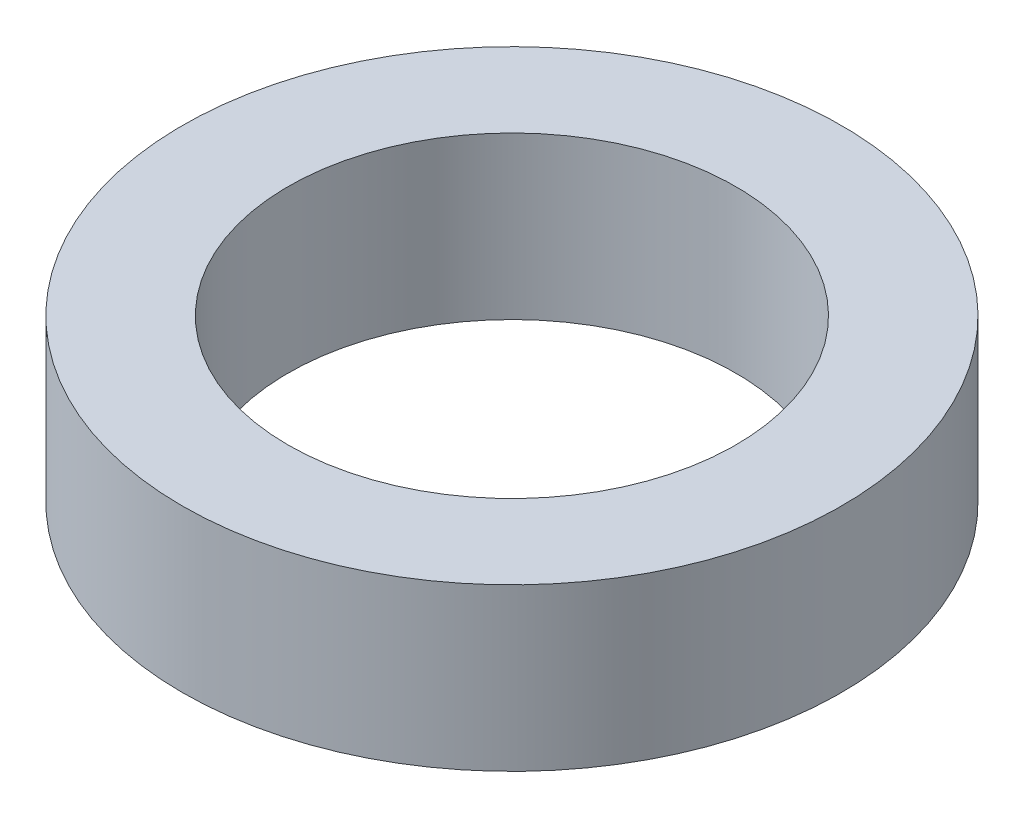
ISO-10303-21;
HEADER;
FILE_DESCRIPTION(('STEP AP214'),'2;1');
FILE_NAME('part.step','',(''),(''),'','','');
FILE_SCHEMA(('AUTOMOTIVE_DESIGN { 1 0 10303 214 1 1 1 1 }'));
ENDSEC;
DATA;
#1=APPLICATION_CONTEXT('core data for automotive mechanical design processes');
#2=APPLICATION_PROTOCOL_DEFINITION('international standard','automotive_design',2000,#1);
#3=PRODUCT_CONTEXT('',#1,'mechanical');
#4=PRODUCT('Part','Part','',(#3));
#5=PRODUCT_RELATED_PRODUCT_CATEGORY('part','',(#4));
#6=PRODUCT_DEFINITION_FORMATION('','',#4);
#7=PRODUCT_DEFINITION_CONTEXT('part definition',#1,'design');
#8=PRODUCT_DEFINITION('design','',#6,#7);
#9=PRODUCT_DEFINITION_SHAPE('','',#8);
#10=(LENGTH_UNIT() NAMED_UNIT(*) SI_UNIT(.MILLI.,.METRE.));
#11=(NAMED_UNIT(*) PLANE_ANGLE_UNIT() SI_UNIT($,.RADIAN.));
#12=(NAMED_UNIT(*) SI_UNIT($,.STERADIAN.) SOLID_ANGLE_UNIT());
#13=UNCERTAINTY_MEASURE_WITH_UNIT(LENGTH_MEASURE(1.E-05),#10,'distance_accuracy_value','');
#14=(GEOMETRIC_REPRESENTATION_CONTEXT(3) GLOBAL_UNCERTAINTY_ASSIGNED_CONTEXT((#13)) GLOBAL_UNIT_ASSIGNED_CONTEXT((#10,
#11,#12)) REPRESENTATION_CONTEXT('',''));
#15=CARTESIAN_POINT('',(0.,0.,0.));
#16=DIRECTION('',(0.,0.,1.));
#17=DIRECTION('',(1.,0.,0.));
#18=AXIS2_PLACEMENT_3D('',#15,#16,#17);
#19=CARTESIAN_POINT('',(0.,3.3,0.));
#20=DIRECTION('',(0.,1.,0.));
#21=DIRECTION('',(0.,0.,1.));
#22=AXIS2_PLACEMENT_3D('',#19,#20,#21);
#23=PLANE('',#22);
#24=CARTESIAN_POINT('',(0.,3.3,0.));
#25=DIRECTION('',(0.,1.,0.));
#26=DIRECTION('',(0.,0.,1.));
#27=AXIS2_PLACEMENT_3D('',#24,#25,#26);
#28=CIRCLE('',#27,6.731);
#29=CARTESIAN_POINT('',(0.,3.3,6.731));
#30=VERTEX_POINT('',#29);
#31=EDGE_CURVE('E10',#30,#30,#28,.T.);
#32=ORIENTED_EDGE('',*,*,#31,.T.);
#33=EDGE_LOOP('',(#32));
#34=FACE_BOUND('',#33,.T.);
#35=CARTESIAN_POINT('',(0.,3.3,0.));
#36=DIRECTION('',(0.,1.,0.));
#37=DIRECTION('',(0.,0.,1.));
#38=AXIS2_PLACEMENT_3D('',#35,#36,#37);
#39=CIRCLE('',#38,4.572);
#40=CARTESIAN_POINT('',(0.,3.3,4.572));
#41=VERTEX_POINT('',#40);
#42=EDGE_CURVE('E42',#41,#41,#39,.T.);
#43=ORIENTED_EDGE('',*,*,#42,.F.);
#44=EDGE_LOOP('',(#43));
#45=FACE_BOUND('',#44,.T.);
#46=ADVANCED_FACE('F31',(#34,#45),#23,.T.);
#47=CARTESIAN_POINT('',(0.,0.,0.));
#48=DIRECTION('',(0.,1.,0.));
#49=DIRECTION('',(0.,0.,1.));
#50=AXIS2_PLACEMENT_3D('',#47,#48,#49);
#51=PLANE('',#50);
#52=CARTESIAN_POINT('',(0.,0.,0.));
#53=DIRECTION('',(0.,1.,0.));
#54=DIRECTION('',(0.,0.,1.));
#55=AXIS2_PLACEMENT_3D('',#52,#53,#54);
#56=CIRCLE('',#55,6.731);
#57=CARTESIAN_POINT('',(0.,0.,6.731));
#58=VERTEX_POINT('',#57);
#59=EDGE_CURVE('E35',#58,#58,#56,.T.);
#60=ORIENTED_EDGE('',*,*,#59,.F.);
#61=EDGE_LOOP('',(#60));
#62=FACE_BOUND('',#61,.T.);
#63=CARTESIAN_POINT('',(0.,0.,0.));
#64=DIRECTION('',(0.,1.,0.));
#65=DIRECTION('',(0.,0.,1.));
#66=AXIS2_PLACEMENT_3D('',#63,#64,#65);
#67=CIRCLE('',#66,4.572);
#68=CARTESIAN_POINT('',(0.,0.,4.572));
#69=VERTEX_POINT('',#68);
#70=EDGE_CURVE('E44',#69,#69,#67,.T.);
#71=ORIENTED_EDGE('',*,*,#70,.T.);
#72=EDGE_LOOP('',(#71));
#73=FACE_BOUND('',#72,.T.);
#74=ADVANCED_FACE('F54',(#62,#73),#51,.F.);
#75=CARTESIAN_POINT('',(0.,3.3,0.));
#76=DIRECTION('',(0.,-1.,0.));
#77=DIRECTION('',(0.,0.,-1.));
#78=AXIS2_PLACEMENT_3D('',#75,#76,#77);
#79=CYLINDRICAL_SURFACE('',#78,6.731);
#80=ORIENTED_EDGE('',*,*,#31,.F.);
#81=EDGE_LOOP('',(#80));
#82=FACE_BOUND('',#81,.T.);
#83=ORIENTED_EDGE('',*,*,#59,.T.);
#84=EDGE_LOOP('',(#83));
#85=FACE_BOUND('',#84,.T.);
#86=ADVANCED_FACE('F33',(#82,#85),#79,.T.);
#87=CARTESIAN_POINT('',(0.,3.3,0.));
#88=DIRECTION('',(0.,-1.,0.));
#89=DIRECTION('',(0.,0.,-1.));
#90=AXIS2_PLACEMENT_3D('',#87,#88,#89);
#91=CYLINDRICAL_SURFACE('',#90,4.572);
#92=ORIENTED_EDGE('',*,*,#42,.T.);
#93=EDGE_LOOP('',(#92));
#94=FACE_BOUND('',#93,.T.);
#95=ORIENTED_EDGE('',*,*,#70,.F.);
#96=EDGE_LOOP('',(#95));
#97=FACE_BOUND('',#96,.T.);
#98=ADVANCED_FACE('F50',(#94,#97),#91,.F.);
#99=CLOSED_SHELL('',(#46,#74,#86,#98));
#100=MANIFOLD_SOLID_BREP('B2',#99);
#101=ADVANCED_BREP_SHAPE_REPRESENTATION('',(#18,#100),#14);
#102=SHAPE_DEFINITION_REPRESENTATION(#9,#101);
ENDSEC;
END-ISO-10303-21;
